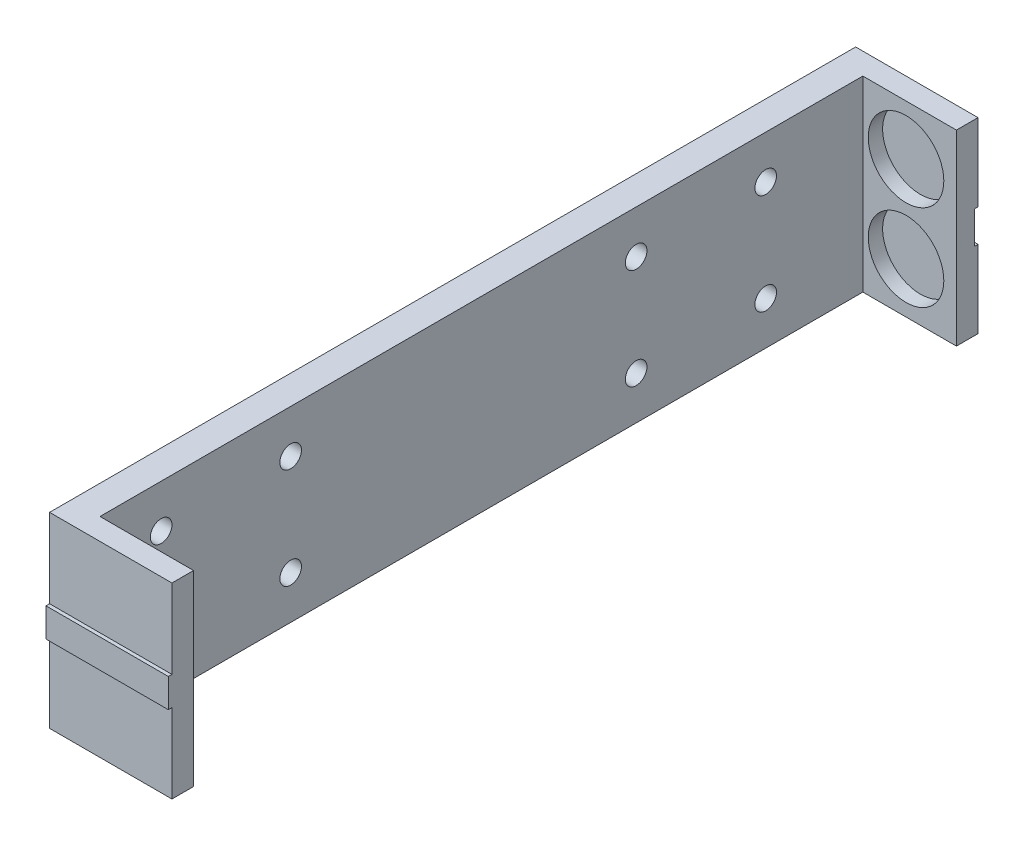
ISO-10303-21;
HEADER;
FILE_DESCRIPTION(('STEP AP214'),'2;1');
FILE_NAME('part.step','',(''),(''),'','','');
FILE_SCHEMA(('AUTOMOTIVE_DESIGN { 1 0 10303 214 1 1 1 1 }'));
ENDSEC;
DATA;
#1=APPLICATION_CONTEXT('core data for automotive mechanical design processes');
#2=APPLICATION_PROTOCOL_DEFINITION('international standard','automotive_design',2000,#1);
#3=PRODUCT_CONTEXT('',#1,'mechanical');
#4=PRODUCT('Part','Part','',(#3));
#5=PRODUCT_RELATED_PRODUCT_CATEGORY('part','',(#4));
#6=PRODUCT_DEFINITION_FORMATION('','',#4);
#7=PRODUCT_DEFINITION_CONTEXT('part definition',#1,'design');
#8=PRODUCT_DEFINITION('design','',#6,#7);
#9=PRODUCT_DEFINITION_SHAPE('','',#8);
#10=(LENGTH_UNIT() NAMED_UNIT(*) SI_UNIT(.MILLI.,.METRE.));
#11=(NAMED_UNIT(*) PLANE_ANGLE_UNIT() SI_UNIT($,.RADIAN.));
#12=(NAMED_UNIT(*) SI_UNIT($,.STERADIAN.) SOLID_ANGLE_UNIT());
#13=UNCERTAINTY_MEASURE_WITH_UNIT(LENGTH_MEASURE(1.E-05),#10,'distance_accuracy_value','');
#14=(GEOMETRIC_REPRESENTATION_CONTEXT(3) GLOBAL_UNCERTAINTY_ASSIGNED_CONTEXT((#13)) GLOBAL_UNIT_ASSIGNED_CONTEXT((#10,
#11,#12)) REPRESENTATION_CONTEXT('',''));
#15=CARTESIAN_POINT('',(0.,0.,0.));
#16=DIRECTION('',(0.,0.,1.));
#17=DIRECTION('',(1.,0.,0.));
#18=AXIS2_PLACEMENT_3D('',#15,#16,#17);
#19=CARTESIAN_POINT('',(0.,0.,-109.));
#20=DIRECTION('',(0.,0.,1.));
#21=DIRECTION('',(1.,0.,0.));
#22=AXIS2_PLACEMENT_3D('',#19,#20,#21);
#23=PLANE('',#22);
#24=DIRECTION('',(0.,1.,0.));
#25=VECTOR('',#24,1.);
#26=CARTESIAN_POINT('',(17.,0.,-109.));
#27=LINE('',#26,#25);
#28=CARTESIAN_POINT('',(17.,15.25,-109.));
#29=VERTEX_POINT('',#28);
#30=CARTESIAN_POINT('',(17.,26.,-109.));
#31=VERTEX_POINT('',#30);
#32=EDGE_CURVE('E328',#29,#31,#27,.T.);
#33=ORIENTED_EDGE('',*,*,#32,.F.);
#34=DIRECTION('',(1.,0.,0.));
#35=VECTOR('',#34,1.);
#36=CARTESIAN_POINT('',(17.,15.25,-109.));
#37=LINE('',#36,#35);
#38=CARTESIAN_POINT('',(0.,15.25,-109.));
#39=VERTEX_POINT('',#38);
#40=EDGE_CURVE('E162',#39,#29,#37,.T.);
#41=ORIENTED_EDGE('',*,*,#40,.F.);
#42=DIRECTION('',(0.,1.,0.));
#43=VECTOR('',#42,1.);
#44=CARTESIAN_POINT('',(0.,26.,-109.));
#45=LINE('',#44,#43);
#46=CARTESIAN_POINT('',(0.,26.,-109.));
#47=VERTEX_POINT('',#46);
#48=EDGE_CURVE('E259',#39,#47,#45,.T.);
#49=ORIENTED_EDGE('',*,*,#48,.T.);
#50=DIRECTION('',(1.,0.,0.));
#51=VECTOR('',#50,1.);
#52=CARTESIAN_POINT('',(0.,26.,-109.));
#53=LINE('',#52,#51);
#54=EDGE_CURVE('E267',#47,#31,#53,.T.);
#55=ORIENTED_EDGE('',*,*,#54,.T.);
#56=EDGE_LOOP('',(#33,#41,#49,#55));
#57=FACE_BOUND('',#56,.T.);
#58=ADVANCED_FACE('F33',(#57),#23,.F.);
#59=CARTESIAN_POINT('',(0.,0.,3.));
#60=DIRECTION('',(0.,0.,-1.));
#61=DIRECTION('',(-1.,0.,0.));
#62=AXIS2_PLACEMENT_3D('',#59,#60,#61);
#63=PLANE('',#62);
#64=DIRECTION('',(-1.,0.,0.));
#65=VECTOR('',#64,1.);
#66=CARTESIAN_POINT('',(0.,15.,3.));
#67=LINE('',#66,#65);
#68=CARTESIAN_POINT('',(17.,15.,3.));
#69=VERTEX_POINT('',#68);
#70=CARTESIAN_POINT('',(0.,15.,3.));
#71=VERTEX_POINT('',#70);
#72=EDGE_CURVE('E58',#69,#71,#67,.T.);
#73=ORIENTED_EDGE('',*,*,#72,.F.);
#74=DIRECTION('',(0.,1.,0.));
#75=VECTOR('',#74,1.);
#76=CARTESIAN_POINT('',(17.,0.,3.));
#77=LINE('',#76,#75);
#78=CARTESIAN_POINT('',(17.,26.,3.));
#79=VERTEX_POINT('',#78);
#80=EDGE_CURVE('E195',#69,#79,#77,.T.);
#81=ORIENTED_EDGE('',*,*,#80,.T.);
#82=DIRECTION('',(-1.,0.,0.));
#83=VECTOR('',#82,1.);
#84=CARTESIAN_POINT('',(0.,26.,3.));
#85=LINE('',#84,#83);
#86=CARTESIAN_POINT('',(0.,26.,3.));
#87=VERTEX_POINT('',#86);
#88=EDGE_CURVE('E229',#79,#87,#85,.T.);
#89=ORIENTED_EDGE('',*,*,#88,.T.);
#90=DIRECTION('',(0.,-1.,0.));
#91=VECTOR('',#90,1.);
#92=CARTESIAN_POINT('',(0.,0.,3.));
#93=LINE('',#92,#91);
#94=EDGE_CURVE('E230',#87,#71,#93,.T.);
#95=ORIENTED_EDGE('',*,*,#94,.T.);
#96=EDGE_LOOP('',(#73,#81,#89,#95));
#97=FACE_BOUND('',#96,.T.);
#98=ADVANCED_FACE('F424',(#97),#63,.F.);
#99=DIRECTION('',(1.,0.,0.));
#100=VECTOR('',#99,1.);
#101=CARTESIAN_POINT('',(0.,11.,3.));
#102=LINE('',#101,#100);
#103=CARTESIAN_POINT('',(0.,11.,3.));
#104=VERTEX_POINT('',#103);
#105=CARTESIAN_POINT('',(17.,11.,3.));
#106=VERTEX_POINT('',#105);
#107=EDGE_CURVE('E190',#104,#106,#102,.T.);
#108=ORIENTED_EDGE('',*,*,#107,.F.);
#109=CARTESIAN_POINT('',(0.,0.,3.));
#110=VERTEX_POINT('',#109);
#111=EDGE_CURVE('E235',#104,#110,#93,.T.);
#112=ORIENTED_EDGE('',*,*,#111,.T.);
#113=DIRECTION('',(1.,0.,0.));
#114=VECTOR('',#113,1.);
#115=CARTESIAN_POINT('',(0.,0.,3.));
#116=LINE('',#115,#114);
#117=CARTESIAN_POINT('',(17.,0.,3.));
#118=VERTEX_POINT('',#117);
#119=EDGE_CURVE('E228',#110,#118,#116,.T.);
#120=ORIENTED_EDGE('',*,*,#119,.T.);
#121=EDGE_CURVE('E227',#118,#106,#77,.T.);
#122=ORIENTED_EDGE('',*,*,#121,.T.);
#123=EDGE_LOOP('',(#108,#112,#120,#122));
#124=FACE_BOUND('',#123,.T.);
#125=ADVANCED_FACE('F426',(#124),#63,.F.);
#126=CARTESIAN_POINT('',(4.,26.,-109.));
#127=DIRECTION('',(-1.,0.,0.));
#128=DIRECTION('',(0.,-1.,0.));
#129=AXIS2_PLACEMENT_3D('',#126,#127,#128);
#130=PLANE('',#129);
#131=CARTESIAN_POINT('',(4.,20.,-8.5));
#132=DIRECTION('',(-1.,0.,0.));
#133=DIRECTION('',(0.,0.,1.));
#134=AXIS2_PLACEMENT_3D('',#131,#132,#133);
#135=CIRCLE('',#134,1.5);
#136=CARTESIAN_POINT('',(4.,20.,-7.));
#137=VERTEX_POINT('',#136);
#138=EDGE_CURVE('E260',#137,#137,#135,.T.);
#139=ORIENTED_EDGE('',*,*,#138,.T.);
#140=EDGE_LOOP('',(#139));
#141=FACE_BOUND('',#140,.T.);
#142=CARTESIAN_POINT('',(4.,6.,-8.5));
#143=DIRECTION('',(-1.,0.,0.));
#144=DIRECTION('',(0.,0.,1.));
#145=AXIS2_PLACEMENT_3D('',#142,#143,#144);
#146=CIRCLE('',#145,1.5);
#147=CARTESIAN_POINT('',(4.,6.,-7.));
#148=VERTEX_POINT('',#147);
#149=EDGE_CURVE('E276',#148,#148,#146,.T.);
#150=ORIENTED_EDGE('',*,*,#149,.T.);
#151=EDGE_LOOP('',(#150));
#152=FACE_BOUND('',#151,.T.);
#153=CARTESIAN_POINT('',(4.,20.,-26.4966825488631));
#154=DIRECTION('',(-1.,0.,0.));
#155=DIRECTION('',(0.,0.,1.));
#156=AXIS2_PLACEMENT_3D('',#153,#154,#155);
#157=CIRCLE('',#156,1.5);
#158=CARTESIAN_POINT('',(4.,20.,-24.9966825488631));
#159=VERTEX_POINT('',#158);
#160=EDGE_CURVE('E282',#159,#159,#157,.T.);
#161=ORIENTED_EDGE('',*,*,#160,.T.);
#162=EDGE_LOOP('',(#161));
#163=FACE_BOUND('',#162,.T.);
#164=CARTESIAN_POINT('',(4.,6.,-26.4966825488631));
#165=DIRECTION('',(-1.,0.,0.));
#166=DIRECTION('',(0.,0.,1.));
#167=AXIS2_PLACEMENT_3D('',#164,#165,#166);
#168=CIRCLE('',#167,1.5);
#169=CARTESIAN_POINT('',(4.,6.,-24.9966825488631));
#170=VERTEX_POINT('',#169);
#171=EDGE_CURVE('E288',#170,#170,#168,.T.);
#172=ORIENTED_EDGE('',*,*,#171,.T.);
#173=EDGE_LOOP('',(#172));
#174=FACE_BOUND('',#173,.T.);
#175=CARTESIAN_POINT('',(4.,19.999545391507,-92.5));
#176=DIRECTION('',(-1.,0.,0.));
#177=DIRECTION('',(0.,0.,1.));
#178=AXIS2_PLACEMENT_3D('',#175,#176,#177);
#179=CIRCLE('',#178,1.5);
#180=CARTESIAN_POINT('',(4.,19.999545391507,-91.));
#181=VERTEX_POINT('',#180);
#182=EDGE_CURVE('E294',#181,#181,#179,.T.);
#183=ORIENTED_EDGE('',*,*,#182,.T.);
#184=EDGE_LOOP('',(#183));
#185=FACE_BOUND('',#184,.T.);
#186=CARTESIAN_POINT('',(4.,6.,-92.5));
#187=DIRECTION('',(-1.,0.,0.));
#188=DIRECTION('',(0.,0.,1.));
#189=AXIS2_PLACEMENT_3D('',#186,#187,#188);
#190=CIRCLE('',#189,1.5);
#191=CARTESIAN_POINT('',(4.,6.,-91.));
#192=VERTEX_POINT('',#191);
#193=EDGE_CURVE('E300',#192,#192,#190,.T.);
#194=ORIENTED_EDGE('',*,*,#193,.T.);
#195=EDGE_LOOP('',(#194));
#196=FACE_BOUND('',#195,.T.);
#197=CARTESIAN_POINT('',(4.,19.999545391507,-74.5));
#198=DIRECTION('',(-1.,0.,0.));
#199=DIRECTION('',(0.,0.,1.));
#200=AXIS2_PLACEMENT_3D('',#197,#198,#199);
#201=CIRCLE('',#200,1.5);
#202=CARTESIAN_POINT('',(4.,19.999545391507,-73.));
#203=VERTEX_POINT('',#202);
#204=EDGE_CURVE('E306',#203,#203,#201,.T.);
#205=ORIENTED_EDGE('',*,*,#204,.T.);
#206=EDGE_LOOP('',(#205));
#207=FACE_BOUND('',#206,.T.);
#208=CARTESIAN_POINT('',(4.,6.,-74.5));
#209=DIRECTION('',(-1.,0.,0.));
#210=DIRECTION('',(0.,0.,1.));
#211=AXIS2_PLACEMENT_3D('',#208,#209,#210);
#212=CIRCLE('',#211,1.5);
#213=CARTESIAN_POINT('',(4.,6.,-73.));
#214=VERTEX_POINT('',#213);
#215=EDGE_CURVE('E312',#214,#214,#212,.T.);
#216=ORIENTED_EDGE('',*,*,#215,.T.);
#217=EDGE_LOOP('',(#216));
#218=FACE_BOUND('',#217,.T.);
#219=DIRECTION('',(0.,-1.,0.));
#220=VECTOR('',#219,1.);
#221=CARTESIAN_POINT('',(4.,0.,-106.));
#222=LINE('',#221,#220);
#223=CARTESIAN_POINT('',(4.,26.,-106.));
#224=VERTEX_POINT('',#223);
#225=CARTESIAN_POINT('',(4.,0.,-106.));
#226=VERTEX_POINT('',#225);
#227=EDGE_CURVE('E326',#224,#226,#222,.T.);
#228=ORIENTED_EDGE('',*,*,#227,.F.);
#229=DIRECTION('',(0.,0.,1.));
#230=VECTOR('',#229,1.);
#231=CARTESIAN_POINT('',(4.,26.,-109.));
#232=LINE('',#231,#230);
#233=CARTESIAN_POINT('',(4.,26.,0.));
#234=VERTEX_POINT('',#233);
#235=EDGE_CURVE('E247',#224,#234,#232,.T.);
#236=ORIENTED_EDGE('',*,*,#235,.T.);
#237=DIRECTION('',(0.,-1.,0.));
#238=VECTOR('',#237,1.);
#239=CARTESIAN_POINT('',(4.,26.,0.));
#240=LINE('',#239,#238);
#241=CARTESIAN_POINT('',(4.,0.,0.));
#242=VERTEX_POINT('',#241);
#243=EDGE_CURVE('E256',#234,#242,#240,.T.);
#244=ORIENTED_EDGE('',*,*,#243,.T.);
#245=DIRECTION('',(0.,0.,1.));
#246=VECTOR('',#245,1.);
#247=CARTESIAN_POINT('',(4.,0.,-109.));
#248=LINE('',#247,#246);
#249=EDGE_CURVE('E251',#226,#242,#248,.T.);
#250=ORIENTED_EDGE('',*,*,#249,.F.);
#251=EDGE_LOOP('',(#228,#236,#244,#250));
#252=FACE_BOUND('',#251,.T.);
#253=ADVANCED_FACE('F385',(#141,#152,#163,#174,#185,#196,#207,#218,#252),#130,.F.);
#254=CARTESIAN_POINT('',(0.,0.,3.));
#255=DIRECTION('',(1.,0.,0.));
#256=DIRECTION('',(0.,0.,-1.));
#257=AXIS2_PLACEMENT_3D('',#254,#255,#256);
#258=PLANE('',#257);
#259=ORIENTED_EDGE('',*,*,#48,.F.);
#260=DIRECTION('',(0.,0.,-1.));
#261=VECTOR('',#260,1.);
#262=CARTESIAN_POINT('',(0.,15.25,-108.5));
#263=LINE('',#262,#261);
#264=CARTESIAN_POINT('',(0.,15.25,-108.5));
#265=VERTEX_POINT('',#264);
#266=EDGE_CURVE('E170',#265,#39,#263,.T.);
#267=ORIENTED_EDGE('',*,*,#266,.F.);
#268=DIRECTION('',(0.,1.,0.));
#269=VECTOR('',#268,1.);
#270=CARTESIAN_POINT('',(0.,15.25,-108.5));
#271=LINE('',#270,#269);
#272=CARTESIAN_POINT('',(0.,10.75,-108.5));
#273=VERTEX_POINT('',#272);
#274=EDGE_CURVE('E155',#273,#265,#271,.T.);
#275=ORIENTED_EDGE('',*,*,#274,.F.);
#276=DIRECTION('',(0.,0.,-1.));
#277=VECTOR('',#276,1.);
#278=CARTESIAN_POINT('',(0.,10.75,-108.5));
#279=LINE('',#278,#277);
#280=CARTESIAN_POINT('',(0.,10.75,-109.));
#281=VERTEX_POINT('',#280);
#282=EDGE_CURVE('E153',#273,#281,#279,.T.);
#283=ORIENTED_EDGE('',*,*,#282,.T.);
#284=CARTESIAN_POINT('',(0.,0.,-109.));
#285=VERTEX_POINT('',#284);
#286=EDGE_CURVE('E270',#285,#281,#45,.T.);
#287=ORIENTED_EDGE('',*,*,#286,.F.);
#288=DIRECTION('',(0.,0.,-1.));
#289=VECTOR('',#288,1.);
#290=CARTESIAN_POINT('',(0.,0.,3.));
#291=LINE('',#290,#289);
#292=EDGE_CURVE('E11',#110,#285,#291,.T.);
#293=ORIENTED_EDGE('',*,*,#292,.F.);
#294=ORIENTED_EDGE('',*,*,#111,.F.);
#295=DIRECTION('',(0.,0.,-1.));
#296=VECTOR('',#295,1.);
#297=CARTESIAN_POINT('',(0.,11.,3.5));
#298=LINE('',#297,#296);
#299=CARTESIAN_POINT('',(0.,11.,3.5));
#300=VERTEX_POINT('',#299);
#301=EDGE_CURVE('E201',#300,#104,#298,.T.);
#302=ORIENTED_EDGE('',*,*,#301,.F.);
#303=DIRECTION('',(0.,-1.,0.));
#304=VECTOR('',#303,1.);
#305=CARTESIAN_POINT('',(0.,11.,3.5));
#306=LINE('',#305,#304);
#307=CARTESIAN_POINT('',(0.,15.,3.5));
#308=VERTEX_POINT('',#307);
#309=EDGE_CURVE('E175',#308,#300,#306,.T.);
#310=ORIENTED_EDGE('',*,*,#309,.F.);
#311=DIRECTION('',(0.,0.,-1.));
#312=VECTOR('',#311,1.);
#313=CARTESIAN_POINT('',(0.,15.,3.5));
#314=LINE('',#313,#312);
#315=EDGE_CURVE('E184',#308,#71,#314,.T.);
#316=ORIENTED_EDGE('',*,*,#315,.T.);
#317=ORIENTED_EDGE('',*,*,#94,.F.);
#318=DIRECTION('',(0.,0.,-1.));
#319=VECTOR('',#318,1.);
#320=CARTESIAN_POINT('',(0.,26.,3.));
#321=LINE('',#320,#319);
#322=EDGE_CURVE('E400',#87,#47,#321,.T.);
#323=ORIENTED_EDGE('',*,*,#322,.T.);
#324=EDGE_LOOP('',(#259,#267,#275,#283,#287,#293,#294,#302,#310,#316,#317,#323));
#325=FACE_BOUND('',#324,.T.);
#326=CARTESIAN_POINT('',(0.,6.,-74.5));
#327=DIRECTION('',(-1.,0.,0.));
#328=DIRECTION('',(0.,0.,1.));
#329=AXIS2_PLACEMENT_3D('',#326,#327,#328);
#330=CIRCLE('',#329,1.5);
#331=CARTESIAN_POINT('',(0.,6.,-73.));
#332=VERTEX_POINT('',#331);
#333=EDGE_CURVE('E315',#332,#332,#330,.T.);
#334=ORIENTED_EDGE('',*,*,#333,.F.);
#335=EDGE_LOOP('',(#334));
#336=FACE_BOUND('',#335,.T.);
#337=CARTESIAN_POINT('',(0.,19.999545391507,-74.5));
#338=DIRECTION('',(-1.,0.,0.));
#339=DIRECTION('',(0.,0.,1.));
#340=AXIS2_PLACEMENT_3D('',#337,#338,#339);
#341=CIRCLE('',#340,1.5);
#342=CARTESIAN_POINT('',(0.,19.999545391507,-73.));
#343=VERTEX_POINT('',#342);
#344=EDGE_CURVE('E309',#343,#343,#341,.T.);
#345=ORIENTED_EDGE('',*,*,#344,.F.);
#346=EDGE_LOOP('',(#345));
#347=FACE_BOUND('',#346,.T.);
#348=CARTESIAN_POINT('',(0.,6.,-92.5));
#349=DIRECTION('',(-1.,0.,0.));
#350=DIRECTION('',(0.,0.,1.));
#351=AXIS2_PLACEMENT_3D('',#348,#349,#350);
#352=CIRCLE('',#351,1.5);
#353=CARTESIAN_POINT('',(0.,6.,-91.));
#354=VERTEX_POINT('',#353);
#355=EDGE_CURVE('E303',#354,#354,#352,.T.);
#356=ORIENTED_EDGE('',*,*,#355,.F.);
#357=EDGE_LOOP('',(#356));
#358=FACE_BOUND('',#357,.T.);
#359=CARTESIAN_POINT('',(0.,19.999545391507,-92.5));
#360=DIRECTION('',(-1.,0.,0.));
#361=DIRECTION('',(0.,0.,1.));
#362=AXIS2_PLACEMENT_3D('',#359,#360,#361);
#363=CIRCLE('',#362,1.5);
#364=CARTESIAN_POINT('',(0.,19.999545391507,-91.));
#365=VERTEX_POINT('',#364);
#366=EDGE_CURVE('E297',#365,#365,#363,.T.);
#367=ORIENTED_EDGE('',*,*,#366,.F.);
#368=EDGE_LOOP('',(#367));
#369=FACE_BOUND('',#368,.T.);
#370=CARTESIAN_POINT('',(0.,6.,-26.4966825488631));
#371=DIRECTION('',(-1.,0.,0.));
#372=DIRECTION('',(0.,0.,1.));
#373=AXIS2_PLACEMENT_3D('',#370,#371,#372);
#374=CIRCLE('',#373,1.5);
#375=CARTESIAN_POINT('',(0.,6.,-24.9966825488631));
#376=VERTEX_POINT('',#375);
#377=EDGE_CURVE('E291',#376,#376,#374,.T.);
#378=ORIENTED_EDGE('',*,*,#377,.F.);
#379=EDGE_LOOP('',(#378));
#380=FACE_BOUND('',#379,.T.);
#381=CARTESIAN_POINT('',(0.,20.,-26.4966825488631));
#382=DIRECTION('',(-1.,0.,0.));
#383=DIRECTION('',(0.,0.,1.));
#384=AXIS2_PLACEMENT_3D('',#381,#382,#383);
#385=CIRCLE('',#384,1.5);
#386=CARTESIAN_POINT('',(0.,20.,-24.9966825488631));
#387=VERTEX_POINT('',#386);
#388=EDGE_CURVE('E285',#387,#387,#385,.T.);
#389=ORIENTED_EDGE('',*,*,#388,.F.);
#390=EDGE_LOOP('',(#389));
#391=FACE_BOUND('',#390,.T.);
#392=CARTESIAN_POINT('',(0.,6.,-8.5));
#393=DIRECTION('',(-1.,0.,0.));
#394=DIRECTION('',(0.,0.,1.));
#395=AXIS2_PLACEMENT_3D('',#392,#393,#394);
#396=CIRCLE('',#395,1.5);
#397=CARTESIAN_POINT('',(0.,6.,-7.));
#398=VERTEX_POINT('',#397);
#399=EDGE_CURVE('E279',#398,#398,#396,.T.);
#400=ORIENTED_EDGE('',*,*,#399,.F.);
#401=EDGE_LOOP('',(#400));
#402=FACE_BOUND('',#401,.T.);
#403=CARTESIAN_POINT('',(0.,20.,-8.5));
#404=DIRECTION('',(-1.,0.,0.));
#405=DIRECTION('',(0.,0.,1.));
#406=AXIS2_PLACEMENT_3D('',#403,#404,#405);
#407=CIRCLE('',#406,1.5);
#408=CARTESIAN_POINT('',(0.,20.,-7.));
#409=VERTEX_POINT('',#408);
#410=EDGE_CURVE('E273',#409,#409,#407,.T.);
#411=ORIENTED_EDGE('',*,*,#410,.F.);
#412=EDGE_LOOP('',(#411));
#413=FACE_BOUND('',#412,.T.);
#414=ADVANCED_FACE('F35',(#325,#336,#347,#358,#369,#380,#391,#402,#413),#258,.F.);
#415=CARTESIAN_POINT('',(0.,0.,3.));
#416=DIRECTION('',(0.,1.,0.));
#417=DIRECTION('',(0.,0.,1.));
#418=AXIS2_PLACEMENT_3D('',#415,#416,#417);
#419=PLANE('',#418);
#420=ORIENTED_EDGE('',*,*,#292,.T.);
#421=DIRECTION('',(-1.,0.,0.));
#422=VECTOR('',#421,1.);
#423=CARTESIAN_POINT('',(0.,0.,-109.));
#424=LINE('',#423,#422);
#425=CARTESIAN_POINT('',(17.,0.,-109.));
#426=VERTEX_POINT('',#425);
#427=EDGE_CURVE('E264',#426,#285,#424,.T.);
#428=ORIENTED_EDGE('',*,*,#427,.F.);
#429=DIRECTION('',(0.,0.,-1.));
#430=VECTOR('',#429,1.);
#431=CARTESIAN_POINT('',(17.,0.,-109.));
#432=LINE('',#431,#430);
#433=CARTESIAN_POINT('',(17.,0.,-106.));
#434=VERTEX_POINT('',#433);
#435=EDGE_CURVE('E325',#434,#426,#432,.T.);
#436=ORIENTED_EDGE('',*,*,#435,.F.);
#437=DIRECTION('',(-1.,0.,0.));
#438=VECTOR('',#437,1.);
#439=CARTESIAN_POINT('',(17.,0.,-106.));
#440=LINE('',#439,#438);
#441=EDGE_CURVE('E322',#434,#226,#440,.T.);
#442=ORIENTED_EDGE('',*,*,#441,.T.);
#443=ORIENTED_EDGE('',*,*,#249,.T.);
#444=DIRECTION('',(1.,0.,0.));
#445=VECTOR('',#444,1.);
#446=CARTESIAN_POINT('',(0.,0.,0.));
#447=LINE('',#446,#445);
#448=CARTESIAN_POINT('',(17.,0.,0.));
#449=VERTEX_POINT('',#448);
#450=EDGE_CURVE('E250',#242,#449,#447,.T.);
#451=ORIENTED_EDGE('',*,*,#450,.T.);
#452=DIRECTION('',(0.,0.,-1.));
#453=VECTOR('',#452,1.);
#454=CARTESIAN_POINT('',(17.,0.,3.));
#455=LINE('',#454,#453);
#456=EDGE_CURVE('E42',#118,#449,#455,.T.);
#457=ORIENTED_EDGE('',*,*,#456,.F.);
#458=ORIENTED_EDGE('',*,*,#119,.F.);
#459=EDGE_LOOP('',(#420,#428,#436,#442,#443,#451,#457,#458));
#460=FACE_BOUND('',#459,.T.);
#461=ADVANCED_FACE('F383',(#460),#419,.F.);
#462=CARTESIAN_POINT('',(17.,0.,3.));
#463=DIRECTION('',(-1.,0.,0.));
#464=DIRECTION('',(0.,0.,1.));
#465=AXIS2_PLACEMENT_3D('',#462,#463,#464);
#466=PLANE('',#465);
#467=DIRECTION('',(0.,1.,0.));
#468=VECTOR('',#467,1.);
#469=CARTESIAN_POINT('',(17.,0.,0.));
#470=LINE('',#469,#468);
#471=CARTESIAN_POINT('',(17.,26.,0.));
#472=VERTEX_POINT('',#471);
#473=EDGE_CURVE('E394',#449,#472,#470,.T.);
#474=ORIENTED_EDGE('',*,*,#473,.T.);
#475=DIRECTION('',(0.,0.,-1.));
#476=VECTOR('',#475,1.);
#477=CARTESIAN_POINT('',(17.,26.,3.));
#478=LINE('',#477,#476);
#479=EDGE_CURVE('E225',#79,#472,#478,.T.);
#480=ORIENTED_EDGE('',*,*,#479,.F.);
#481=ORIENTED_EDGE('',*,*,#80,.F.);
#482=DIRECTION('',(0.,0.,-1.));
#483=VECTOR('',#482,1.);
#484=CARTESIAN_POINT('',(17.,15.,3.5));
#485=LINE('',#484,#483);
#486=CARTESIAN_POINT('',(17.,15.,3.5));
#487=VERTEX_POINT('',#486);
#488=EDGE_CURVE('E202',#487,#69,#485,.T.);
#489=ORIENTED_EDGE('',*,*,#488,.F.);
#490=DIRECTION('',(0.,1.,0.));
#491=VECTOR('',#490,1.);
#492=CARTESIAN_POINT('',(17.,11.,3.5));
#493=LINE('',#492,#491);
#494=CARTESIAN_POINT('',(17.,11.,3.5));
#495=VERTEX_POINT('',#494);
#496=EDGE_CURVE('E180',#495,#487,#493,.T.);
#497=ORIENTED_EDGE('',*,*,#496,.F.);
#498=DIRECTION('',(0.,0.,-1.));
#499=VECTOR('',#498,1.);
#500=CARTESIAN_POINT('',(17.,11.,3.5));
#501=LINE('',#500,#499);
#502=EDGE_CURVE('E198',#495,#106,#501,.T.);
#503=ORIENTED_EDGE('',*,*,#502,.T.);
#504=ORIENTED_EDGE('',*,*,#121,.F.);
#505=ORIENTED_EDGE('',*,*,#456,.T.);
#506=EDGE_LOOP('',(#474,#480,#481,#489,#497,#503,#504,#505));
#507=FACE_BOUND('',#506,.T.);
#508=ADVANCED_FACE('F222',(#507),#466,.F.);
#509=CARTESIAN_POINT('',(0.,26.,3.));
#510=DIRECTION('',(0.,-1.,0.));
#511=DIRECTION('',(0.,0.,-1.));
#512=AXIS2_PLACEMENT_3D('',#509,#510,#511);
#513=PLANE('',#512);
#514=DIRECTION('',(-1.,0.,0.));
#515=VECTOR('',#514,1.);
#516=CARTESIAN_POINT('',(0.,26.,0.));
#517=LINE('',#516,#515);
#518=EDGE_CURVE('E245',#472,#234,#517,.T.);
#519=ORIENTED_EDGE('',*,*,#518,.T.);
#520=ORIENTED_EDGE('',*,*,#235,.F.);
#521=DIRECTION('',(-1.,0.,0.));
#522=VECTOR('',#521,1.);
#523=CARTESIAN_POINT('',(17.,26.,-106.));
#524=LINE('',#523,#522);
#525=CARTESIAN_POINT('',(17.,26.,-106.));
#526=VERTEX_POINT('',#525);
#527=EDGE_CURVE('E318',#526,#224,#524,.T.);
#528=ORIENTED_EDGE('',*,*,#527,.F.);
#529=DIRECTION('',(0.,0.,1.));
#530=VECTOR('',#529,1.);
#531=CARTESIAN_POINT('',(17.,26.,-109.));
#532=LINE('',#531,#530);
#533=EDGE_CURVE('E333',#31,#526,#532,.T.);
#534=ORIENTED_EDGE('',*,*,#533,.F.);
#535=ORIENTED_EDGE('',*,*,#54,.F.);
#536=ORIENTED_EDGE('',*,*,#322,.F.);
#537=ORIENTED_EDGE('',*,*,#88,.F.);
#538=ORIENTED_EDGE('',*,*,#479,.T.);
#539=EDGE_LOOP('',(#519,#520,#528,#534,#535,#536,#537,#538));
#540=FACE_BOUND('',#539,.T.);
#541=ADVANCED_FACE('F393',(#540),#513,.F.);
#542=CARTESIAN_POINT('',(0.,0.,0.));
#543=DIRECTION('',(0.,0.,-1.));
#544=DIRECTION('',(-1.,0.,0.));
#545=AXIS2_PLACEMENT_3D('',#542,#543,#544);
#546=PLANE('',#545);
#547=CARTESIAN_POINT('',(10.,19.,0.));
#548=DIRECTION('',(0.,0.,-1.));
#549=DIRECTION('',(-1.,0.,0.));
#550=AXIS2_PLACEMENT_3D('',#547,#548,#549);
#551=CIRCLE('',#550,5.25);
#552=CARTESIAN_POINT('',(4.75,19.,0.));
#553=VERTEX_POINT('',#552);
#554=EDGE_CURVE('E342',#553,#553,#551,.T.);
#555=ORIENTED_EDGE('',*,*,#554,.F.);
#556=EDGE_LOOP('',(#555));
#557=FACE_BOUND('',#556,.T.);
#558=CARTESIAN_POINT('',(10.,7.,0.));
#559=DIRECTION('',(0.,0.,-1.));
#560=DIRECTION('',(-1.,0.,0.));
#561=AXIS2_PLACEMENT_3D('',#558,#559,#560);
#562=CIRCLE('',#561,5.25);
#563=CARTESIAN_POINT('',(4.75,7.,0.));
#564=VERTEX_POINT('',#563);
#565=EDGE_CURVE('E336',#564,#564,#562,.T.);
#566=ORIENTED_EDGE('',*,*,#565,.F.);
#567=EDGE_LOOP('',(#566));
#568=FACE_BOUND('',#567,.T.);
#569=ORIENTED_EDGE('',*,*,#243,.F.);
#570=ORIENTED_EDGE('',*,*,#518,.F.);
#571=ORIENTED_EDGE('',*,*,#473,.F.);
#572=ORIENTED_EDGE('',*,*,#450,.F.);
#573=EDGE_LOOP('',(#569,#570,#571,#572));
#574=FACE_BOUND('',#573,.T.);
#575=ADVANCED_FACE('F390',(#557,#568,#574),#546,.T.);
#576=ORIENTED_EDGE('',*,*,#286,.T.);
#577=DIRECTION('',(-1.,0.,0.));
#578=VECTOR('',#577,1.);
#579=CARTESIAN_POINT('',(17.,10.75,-109.));
#580=LINE('',#579,#578);
#581=CARTESIAN_POINT('',(17.,10.75,-109.));
#582=VERTEX_POINT('',#581);
#583=EDGE_CURVE('E414',#582,#281,#580,.T.);
#584=ORIENTED_EDGE('',*,*,#583,.F.);
#585=EDGE_CURVE('E168',#426,#582,#27,.T.);
#586=ORIENTED_EDGE('',*,*,#585,.F.);
#587=ORIENTED_EDGE('',*,*,#427,.T.);
#588=EDGE_LOOP('',(#576,#584,#586,#587));
#589=FACE_BOUND('',#588,.T.);
#590=ADVANCED_FACE('F413',(#589),#23,.F.);
#591=CARTESIAN_POINT('',(4.,20.,-8.5));
#592=DIRECTION('',(-1.,0.,0.));
#593=DIRECTION('',(0.,0.,1.));
#594=AXIS2_PLACEMENT_3D('',#591,#592,#593);
#595=CYLINDRICAL_SURFACE('',#594,1.5);
#596=ORIENTED_EDGE('',*,*,#138,.F.);
#597=EDGE_LOOP('',(#596));
#598=FACE_BOUND('',#597,.T.);
#599=ORIENTED_EDGE('',*,*,#410,.T.);
#600=EDGE_LOOP('',(#599));
#601=FACE_BOUND('',#600,.T.);
#602=ADVANCED_FACE('F487',(#598,#601),#595,.F.);
#603=CARTESIAN_POINT('',(4.,6.,-8.5));
#604=DIRECTION('',(-1.,0.,0.));
#605=DIRECTION('',(0.,0.,1.));
#606=AXIS2_PLACEMENT_3D('',#603,#604,#605);
#607=CYLINDRICAL_SURFACE('',#606,1.5);
#608=ORIENTED_EDGE('',*,*,#149,.F.);
#609=EDGE_LOOP('',(#608));
#610=FACE_BOUND('',#609,.T.);
#611=ORIENTED_EDGE('',*,*,#399,.T.);
#612=EDGE_LOOP('',(#611));
#613=FACE_BOUND('',#612,.T.);
#614=ADVANCED_FACE('F489',(#610,#613),#607,.F.);
#615=CARTESIAN_POINT('',(4.,20.,-26.4966825488631));
#616=DIRECTION('',(-1.,0.,0.));
#617=DIRECTION('',(0.,0.,1.));
#618=AXIS2_PLACEMENT_3D('',#615,#616,#617);
#619=CYLINDRICAL_SURFACE('',#618,1.5);
#620=ORIENTED_EDGE('',*,*,#160,.F.);
#621=EDGE_LOOP('',(#620));
#622=FACE_BOUND('',#621,.T.);
#623=ORIENTED_EDGE('',*,*,#388,.T.);
#624=EDGE_LOOP('',(#623));
#625=FACE_BOUND('',#624,.T.);
#626=ADVANCED_FACE('F496',(#622,#625),#619,.F.);
#627=CARTESIAN_POINT('',(4.,6.,-26.4966825488631));
#628=DIRECTION('',(-1.,0.,0.));
#629=DIRECTION('',(0.,0.,1.));
#630=AXIS2_PLACEMENT_3D('',#627,#628,#629);
#631=CYLINDRICAL_SURFACE('',#630,1.5);
#632=ORIENTED_EDGE('',*,*,#171,.F.);
#633=EDGE_LOOP('',(#632));
#634=FACE_BOUND('',#633,.T.);
#635=ORIENTED_EDGE('',*,*,#377,.T.);
#636=EDGE_LOOP('',(#635));
#637=FACE_BOUND('',#636,.T.);
#638=ADVANCED_FACE('F502',(#634,#637),#631,.F.);
#639=CARTESIAN_POINT('',(4.,19.999545391507,-92.5));
#640=DIRECTION('',(-1.,0.,0.));
#641=DIRECTION('',(0.,0.,1.));
#642=AXIS2_PLACEMENT_3D('',#639,#640,#641);
#643=CYLINDRICAL_SURFACE('',#642,1.5);
#644=ORIENTED_EDGE('',*,*,#182,.F.);
#645=EDGE_LOOP('',(#644));
#646=FACE_BOUND('',#645,.T.);
#647=ORIENTED_EDGE('',*,*,#366,.T.);
#648=EDGE_LOOP('',(#647));
#649=FACE_BOUND('',#648,.T.);
#650=ADVANCED_FACE('F506',(#646,#649),#643,.F.);
#651=CARTESIAN_POINT('',(4.,6.,-92.5));
#652=DIRECTION('',(-1.,0.,0.));
#653=DIRECTION('',(0.,0.,1.));
#654=AXIS2_PLACEMENT_3D('',#651,#652,#653);
#655=CYLINDRICAL_SURFACE('',#654,1.5);
#656=ORIENTED_EDGE('',*,*,#193,.F.);
#657=EDGE_LOOP('',(#656));
#658=FACE_BOUND('',#657,.T.);
#659=ORIENTED_EDGE('',*,*,#355,.T.);
#660=EDGE_LOOP('',(#659));
#661=FACE_BOUND('',#660,.T.);
#662=ADVANCED_FACE('F510',(#658,#661),#655,.F.);
#663=CARTESIAN_POINT('',(4.,19.999545391507,-74.5));
#664=DIRECTION('',(-1.,0.,0.));
#665=DIRECTION('',(0.,0.,1.));
#666=AXIS2_PLACEMENT_3D('',#663,#664,#665);
#667=CYLINDRICAL_SURFACE('',#666,1.5);
#668=ORIENTED_EDGE('',*,*,#204,.F.);
#669=EDGE_LOOP('',(#668));
#670=FACE_BOUND('',#669,.T.);
#671=ORIENTED_EDGE('',*,*,#344,.T.);
#672=EDGE_LOOP('',(#671));
#673=FACE_BOUND('',#672,.T.);
#674=ADVANCED_FACE('F469',(#670,#673),#667,.F.);
#675=CARTESIAN_POINT('',(4.,6.,-74.5));
#676=DIRECTION('',(-1.,0.,0.));
#677=DIRECTION('',(0.,0.,1.));
#678=AXIS2_PLACEMENT_3D('',#675,#676,#677);
#679=CYLINDRICAL_SURFACE('',#678,1.5);
#680=ORIENTED_EDGE('',*,*,#215,.F.);
#681=EDGE_LOOP('',(#680));
#682=FACE_BOUND('',#681,.T.);
#683=ORIENTED_EDGE('',*,*,#333,.T.);
#684=EDGE_LOOP('',(#683));
#685=FACE_BOUND('',#684,.T.);
#686=ADVANCED_FACE('F370',(#682,#685),#679,.F.);
#687=CARTESIAN_POINT('',(17.,0.,-106.));
#688=DIRECTION('',(0.,0.,-1.));
#689=DIRECTION('',(0.,1.,0.));
#690=AXIS2_PLACEMENT_3D('',#687,#688,#689);
#691=PLANE('',#690);
#692=CARTESIAN_POINT('',(10.,7.00000000000006,-106.));
#693=DIRECTION('',(0.,0.,1.));
#694=DIRECTION('',(1.,0.,0.));
#695=AXIS2_PLACEMENT_3D('',#692,#693,#694);
#696=CIRCLE('',#695,5.25);
#697=CARTESIAN_POINT('',(15.25,7.00000000000006,-106.));
#698=VERTEX_POINT('',#697);
#699=EDGE_CURVE('E207',#698,#698,#696,.T.);
#700=ORIENTED_EDGE('',*,*,#699,.F.);
#701=EDGE_LOOP('',(#700));
#702=FACE_BOUND('',#701,.T.);
#703=CARTESIAN_POINT('',(10.,19.0000000000001,-106.));
#704=DIRECTION('',(0.,0.,1.));
#705=DIRECTION('',(1.,0.,0.));
#706=AXIS2_PLACEMENT_3D('',#703,#704,#705);
#707=CIRCLE('',#706,5.25);
#708=CARTESIAN_POINT('',(15.25,19.0000000000001,-106.));
#709=VERTEX_POINT('',#708);
#710=EDGE_CURVE('E348',#709,#709,#707,.T.);
#711=ORIENTED_EDGE('',*,*,#710,.F.);
#712=EDGE_LOOP('',(#711));
#713=FACE_BOUND('',#712,.T.);
#714=ORIENTED_EDGE('',*,*,#227,.T.);
#715=ORIENTED_EDGE('',*,*,#441,.F.);
#716=DIRECTION('',(0.,-1.,0.));
#717=VECTOR('',#716,1.);
#718=CARTESIAN_POINT('',(17.,0.,-106.));
#719=LINE('',#718,#717);
#720=EDGE_CURVE('E331',#526,#434,#719,.T.);
#721=ORIENTED_EDGE('',*,*,#720,.F.);
#722=ORIENTED_EDGE('',*,*,#527,.T.);
#723=EDGE_LOOP('',(#714,#715,#721,#722));
#724=FACE_BOUND('',#723,.T.);
#725=ADVANCED_FACE('F367',(#702,#713,#724),#691,.F.);
#726=CARTESIAN_POINT('',(17.,0.,0.));
#727=DIRECTION('',(1.,0.,0.));
#728=DIRECTION('',(0.,1.,0.));
#729=AXIS2_PLACEMENT_3D('',#726,#727,#728);
#730=PLANE('',#729);
#731=DIRECTION('',(0.,0.,-1.));
#732=VECTOR('',#731,1.);
#733=CARTESIAN_POINT('',(17.,15.25,-108.5));
#734=LINE('',#733,#732);
#735=CARTESIAN_POINT('',(17.,15.25,-108.5));
#736=VERTEX_POINT('',#735);
#737=EDGE_CURVE('E194',#736,#29,#734,.T.);
#738=ORIENTED_EDGE('',*,*,#737,.T.);
#739=ORIENTED_EDGE('',*,*,#32,.T.);
#740=ORIENTED_EDGE('',*,*,#533,.T.);
#741=ORIENTED_EDGE('',*,*,#720,.T.);
#742=ORIENTED_EDGE('',*,*,#435,.T.);
#743=ORIENTED_EDGE('',*,*,#585,.T.);
#744=DIRECTION('',(0.,0.,-1.));
#745=VECTOR('',#744,1.);
#746=CARTESIAN_POINT('',(17.,10.75,-108.5));
#747=LINE('',#746,#745);
#748=CARTESIAN_POINT('',(17.,10.75,-108.5));
#749=VERTEX_POINT('',#748);
#750=EDGE_CURVE('E150',#749,#582,#747,.T.);
#751=ORIENTED_EDGE('',*,*,#750,.F.);
#752=DIRECTION('',(0.,-1.,0.));
#753=VECTOR('',#752,1.);
#754=CARTESIAN_POINT('',(17.,15.25,-108.5));
#755=LINE('',#754,#753);
#756=EDGE_CURVE('E156',#736,#749,#755,.T.);
#757=ORIENTED_EDGE('',*,*,#756,.F.);
#758=EDGE_LOOP('',(#738,#739,#740,#741,#742,#743,#751,#757));
#759=FACE_BOUND('',#758,.T.);
#760=ADVANCED_FACE('F165',(#759),#730,.T.);
#761=CARTESIAN_POINT('',(10.,7.,2.));
#762=DIRECTION('',(0.,0.,-1.));
#763=DIRECTION('',(-1.,0.,0.));
#764=AXIS2_PLACEMENT_3D('',#761,#762,#763);
#765=CYLINDRICAL_SURFACE('',#764,5.25);
#766=CARTESIAN_POINT('',(10.,7.,2.));
#767=DIRECTION('',(0.,0.,-1.));
#768=DIRECTION('',(-1.,0.,0.));
#769=AXIS2_PLACEMENT_3D('',#766,#767,#768);
#770=CIRCLE('',#769,5.25);
#771=CARTESIAN_POINT('',(4.75,7.,2.));
#772=VERTEX_POINT('',#771);
#773=EDGE_CURVE('E329',#772,#772,#770,.T.);
#774=ORIENTED_EDGE('',*,*,#773,.F.);
#775=EDGE_LOOP('',(#774));
#776=FACE_BOUND('',#775,.T.);
#777=ORIENTED_EDGE('',*,*,#565,.T.);
#778=EDGE_LOOP('',(#777));
#779=FACE_BOUND('',#778,.T.);
#780=ADVANCED_FACE('F520',(#776,#779),#765,.F.);
#781=CARTESIAN_POINT('',(10.,7.,2.));
#782=DIRECTION('',(0.,0.,-1.));
#783=DIRECTION('',(-1.,0.,0.));
#784=AXIS2_PLACEMENT_3D('',#781,#782,#783);
#785=PLANE('',#784);
#786=ORIENTED_EDGE('',*,*,#773,.T.);
#787=EDGE_LOOP('',(#786));
#788=FACE_BOUND('',#787,.T.);
#789=ADVANCED_FACE('F523',(#788),#785,.T.);
#790=CARTESIAN_POINT('',(10.,19.,2.));
#791=DIRECTION('',(0.,0.,-1.));
#792=DIRECTION('',(-1.,0.,0.));
#793=AXIS2_PLACEMENT_3D('',#790,#791,#792);
#794=CYLINDRICAL_SURFACE('',#793,5.25);
#795=CARTESIAN_POINT('',(10.,19.,2.));
#796=DIRECTION('',(0.,0.,-1.));
#797=DIRECTION('',(-1.,0.,0.));
#798=AXIS2_PLACEMENT_3D('',#795,#796,#797);
#799=CIRCLE('',#798,5.25);
#800=CARTESIAN_POINT('',(4.75,19.,2.));
#801=VERTEX_POINT('',#800);
#802=EDGE_CURVE('E339',#801,#801,#799,.T.);
#803=ORIENTED_EDGE('',*,*,#802,.F.);
#804=EDGE_LOOP('',(#803));
#805=FACE_BOUND('',#804,.T.);
#806=ORIENTED_EDGE('',*,*,#554,.T.);
#807=EDGE_LOOP('',(#806));
#808=FACE_BOUND('',#807,.T.);
#809=ADVANCED_FACE('F527',(#805,#808),#794,.F.);
#810=CARTESIAN_POINT('',(10.,19.,2.));
#811=DIRECTION('',(0.,0.,-1.));
#812=DIRECTION('',(-1.,0.,0.));
#813=AXIS2_PLACEMENT_3D('',#810,#811,#812);
#814=PLANE('',#813);
#815=ORIENTED_EDGE('',*,*,#802,.T.);
#816=EDGE_LOOP('',(#815));
#817=FACE_BOUND('',#816,.T.);
#818=ADVANCED_FACE('F531',(#817),#814,.T.);
#819=CARTESIAN_POINT('',(10.,19.0000000000001,-108.));
#820=DIRECTION('',(0.,0.,1.));
#821=DIRECTION('',(1.,0.,0.));
#822=AXIS2_PLACEMENT_3D('',#819,#820,#821);
#823=CYLINDRICAL_SURFACE('',#822,5.25);
#824=CARTESIAN_POINT('',(10.,19.0000000000001,-108.));
#825=DIRECTION('',(0.,0.,1.));
#826=DIRECTION('',(1.,0.,0.));
#827=AXIS2_PLACEMENT_3D('',#824,#825,#826);
#828=CIRCLE('',#827,5.25);
#829=CARTESIAN_POINT('',(15.25,19.0000000000001,-108.));
#830=VERTEX_POINT('',#829);
#831=EDGE_CURVE('E345',#830,#830,#828,.T.);
#832=ORIENTED_EDGE('',*,*,#831,.F.);
#833=EDGE_LOOP('',(#832));
#834=FACE_BOUND('',#833,.T.);
#835=ORIENTED_EDGE('',*,*,#710,.T.);
#836=EDGE_LOOP('',(#835));
#837=FACE_BOUND('',#836,.T.);
#838=ADVANCED_FACE('F535',(#834,#837),#823,.F.);
#839=CARTESIAN_POINT('',(10.,19.0000000000001,-108.));
#840=DIRECTION('',(0.,0.,1.));
#841=DIRECTION('',(1.,0.,0.));
#842=AXIS2_PLACEMENT_3D('',#839,#840,#841);
#843=PLANE('',#842);
#844=ORIENTED_EDGE('',*,*,#831,.T.);
#845=EDGE_LOOP('',(#844));
#846=FACE_BOUND('',#845,.T.);
#847=ADVANCED_FACE('F363',(#846),#843,.T.);
#848=CARTESIAN_POINT('',(10.,7.00000000000006,-108.));
#849=DIRECTION('',(0.,0.,1.));
#850=DIRECTION('',(1.,0.,0.));
#851=AXIS2_PLACEMENT_3D('',#848,#849,#850);
#852=CYLINDRICAL_SURFACE('',#851,5.25);
#853=CARTESIAN_POINT('',(10.,7.00000000000006,-108.));
#854=DIRECTION('',(0.,0.,1.));
#855=DIRECTION('',(1.,0.,0.));
#856=AXIS2_PLACEMENT_3D('',#853,#854,#855);
#857=CIRCLE('',#856,5.25);
#858=CARTESIAN_POINT('',(15.25,7.00000000000006,-108.));
#859=VERTEX_POINT('',#858);
#860=EDGE_CURVE('E351',#859,#859,#857,.T.);
#861=ORIENTED_EDGE('',*,*,#860,.F.);
#862=EDGE_LOOP('',(#861));
#863=FACE_BOUND('',#862,.T.);
#864=ORIENTED_EDGE('',*,*,#699,.T.);
#865=EDGE_LOOP('',(#864));
#866=FACE_BOUND('',#865,.T.);
#867=ADVANCED_FACE('F360',(#863,#866),#852,.F.);
#868=CARTESIAN_POINT('',(10.,7.00000000000006,-108.));
#869=DIRECTION('',(0.,0.,1.));
#870=DIRECTION('',(1.,0.,0.));
#871=AXIS2_PLACEMENT_3D('',#868,#869,#870);
#872=PLANE('',#871);
#873=ORIENTED_EDGE('',*,*,#860,.T.);
#874=EDGE_LOOP('',(#873));
#875=FACE_BOUND('',#874,.T.);
#876=ADVANCED_FACE('F358',(#875),#872,.T.);
#877=CARTESIAN_POINT('',(0.,11.,3.5));
#878=DIRECTION('',(0.,1.,0.));
#879=DIRECTION('',(0.,0.,1.));
#880=AXIS2_PLACEMENT_3D('',#877,#878,#879);
#881=PLANE('',#880);
#882=ORIENTED_EDGE('',*,*,#107,.T.);
#883=ORIENTED_EDGE('',*,*,#502,.F.);
#884=DIRECTION('',(1.,0.,0.));
#885=VECTOR('',#884,1.);
#886=CARTESIAN_POINT('',(0.,11.,3.5));
#887=LINE('',#886,#885);
#888=EDGE_CURVE('E178',#300,#495,#887,.T.);
#889=ORIENTED_EDGE('',*,*,#888,.F.);
#890=ORIENTED_EDGE('',*,*,#301,.T.);
#891=EDGE_LOOP('',(#882,#883,#889,#890));
#892=FACE_BOUND('',#891,.T.);
#893=ADVANCED_FACE('F545',(#892),#881,.F.);
#894=CARTESIAN_POINT('',(0.,15.,3.5));
#895=DIRECTION('',(0.,-1.,0.));
#896=DIRECTION('',(0.,0.,-1.));
#897=AXIS2_PLACEMENT_3D('',#894,#895,#896);
#898=PLANE('',#897);
#899=ORIENTED_EDGE('',*,*,#72,.T.);
#900=ORIENTED_EDGE('',*,*,#315,.F.);
#901=DIRECTION('',(-1.,0.,0.));
#902=VECTOR('',#901,1.);
#903=CARTESIAN_POINT('',(0.,15.,3.5));
#904=LINE('',#903,#902);
#905=EDGE_CURVE('E182',#487,#308,#904,.T.);
#906=ORIENTED_EDGE('',*,*,#905,.F.);
#907=ORIENTED_EDGE('',*,*,#488,.T.);
#908=EDGE_LOOP('',(#899,#900,#906,#907));
#909=FACE_BOUND('',#908,.T.);
#910=ADVANCED_FACE('F218',(#909),#898,.F.);
#911=CARTESIAN_POINT('',(0.,0.,3.5));
#912=DIRECTION('',(0.,0.,-1.));
#913=DIRECTION('',(-1.,0.,0.));
#914=AXIS2_PLACEMENT_3D('',#911,#912,#913);
#915=PLANE('',#914);
#916=ORIENTED_EDGE('',*,*,#309,.T.);
#917=ORIENTED_EDGE('',*,*,#888,.T.);
#918=ORIENTED_EDGE('',*,*,#496,.T.);
#919=ORIENTED_EDGE('',*,*,#905,.T.);
#920=EDGE_LOOP('',(#916,#917,#918,#919));
#921=FACE_BOUND('',#920,.T.);
#922=ADVANCED_FACE('F551',(#921),#915,.F.);
#923=CARTESIAN_POINT('',(17.,15.25,-108.5));
#924=DIRECTION('',(0.,1.,0.));
#925=DIRECTION('',(0.,0.,1.));
#926=AXIS2_PLACEMENT_3D('',#923,#924,#925);
#927=PLANE('',#926);
#928=ORIENTED_EDGE('',*,*,#40,.T.);
#929=ORIENTED_EDGE('',*,*,#737,.F.);
#930=DIRECTION('',(1.,0.,0.));
#931=VECTOR('',#930,1.);
#932=CARTESIAN_POINT('',(17.,15.25,-108.5));
#933=LINE('',#932,#931);
#934=EDGE_CURVE('E50',#265,#736,#933,.T.);
#935=ORIENTED_EDGE('',*,*,#934,.F.);
#936=ORIENTED_EDGE('',*,*,#266,.T.);
#937=EDGE_LOOP('',(#928,#929,#935,#936));
#938=FACE_BOUND('',#937,.T.);
#939=ADVANCED_FACE('F554',(#938),#927,.F.);
#940=CARTESIAN_POINT('',(17.,10.75,-108.5));
#941=DIRECTION('',(0.,-1.,0.));
#942=DIRECTION('',(0.,0.,-1.));
#943=AXIS2_PLACEMENT_3D('',#940,#941,#942);
#944=PLANE('',#943);
#945=ORIENTED_EDGE('',*,*,#583,.T.);
#946=ORIENTED_EDGE('',*,*,#282,.F.);
#947=DIRECTION('',(-1.,0.,0.));
#948=VECTOR('',#947,1.);
#949=CARTESIAN_POINT('',(17.,10.75,-108.5));
#950=LINE('',#949,#948);
#951=EDGE_CURVE('E147',#749,#273,#950,.T.);
#952=ORIENTED_EDGE('',*,*,#951,.F.);
#953=ORIENTED_EDGE('',*,*,#750,.T.);
#954=EDGE_LOOP('',(#945,#946,#952,#953));
#955=FACE_BOUND('',#954,.T.);
#956=ADVANCED_FACE('F148',(#955),#944,.F.);
#957=CARTESIAN_POINT('',(0.,0.,-108.5));
#958=DIRECTION('',(0.,0.,-1.));
#959=DIRECTION('',(-1.,0.,0.));
#960=AXIS2_PLACEMENT_3D('',#957,#958,#959);
#961=PLANE('',#960);
#962=ORIENTED_EDGE('',*,*,#756,.T.);
#963=ORIENTED_EDGE('',*,*,#951,.T.);
#964=ORIENTED_EDGE('',*,*,#274,.T.);
#965=ORIENTED_EDGE('',*,*,#934,.T.);
#966=EDGE_LOOP('',(#962,#963,#964,#965));
#967=FACE_BOUND('',#966,.T.);
#968=ADVANCED_FACE('F159',(#967),#961,.T.);
#969=CLOSED_SHELL('',(#58,#98,#125,#253,#414,#461,#508,#541,#575,#590,#602,#614,#626,#638,#650,
#662,#674,#686,#725,#760,#780,#789,#809,#818,#838,#847,#867,#876,#893,#910,#922,#939,#956,#968));
#970=MANIFOLD_SOLID_BREP('B2',#969);
#971=ADVANCED_BREP_SHAPE_REPRESENTATION('',(#18,#970),#14);
#972=SHAPE_DEFINITION_REPRESENTATION(#9,#971);
ENDSEC;
END-ISO-10303-21;
